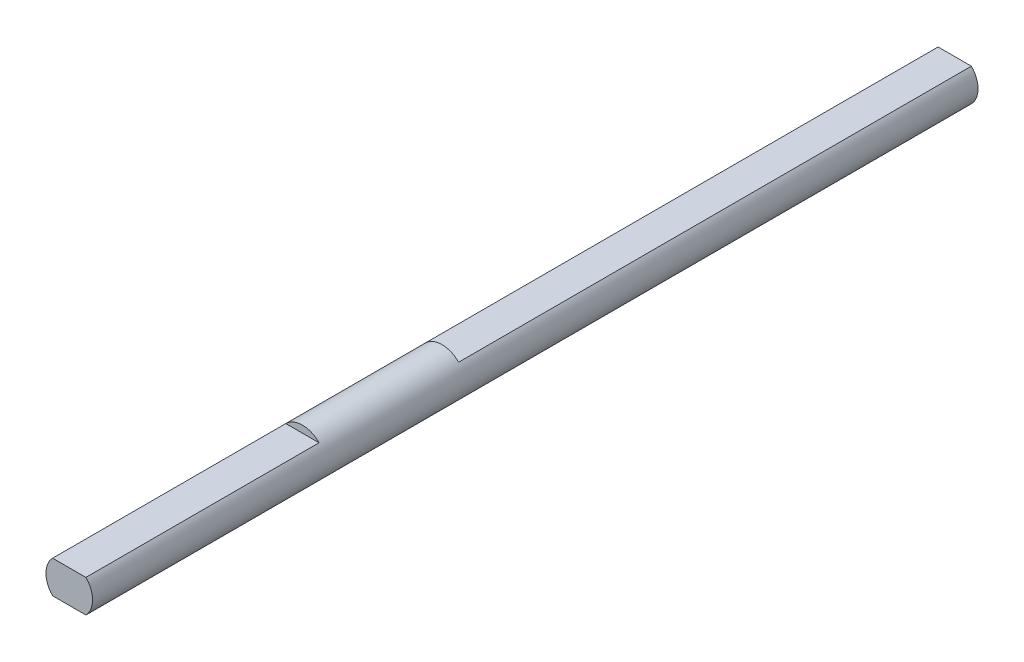
ISO-10303-21;
HEADER;
FILE_DESCRIPTION(('STEP AP214'),'2;1');
FILE_NAME('part.step','',(''),(''),'','','');
FILE_SCHEMA(('AUTOMOTIVE_DESIGN { 1 0 10303 214 1 1 1 1 }'));
ENDSEC;
DATA;
#1=APPLICATION_CONTEXT('core data for automotive mechanical design processes');
#2=APPLICATION_PROTOCOL_DEFINITION('international standard','automotive_design',2000,#1);
#3=PRODUCT_CONTEXT('',#1,'mechanical');
#4=PRODUCT('Part','Part','',(#3));
#5=PRODUCT_RELATED_PRODUCT_CATEGORY('part','',(#4));
#6=PRODUCT_DEFINITION_FORMATION('','',#4);
#7=PRODUCT_DEFINITION_CONTEXT('part definition',#1,'design');
#8=PRODUCT_DEFINITION('design','',#6,#7);
#9=PRODUCT_DEFINITION_SHAPE('','',#8);
#10=(LENGTH_UNIT() NAMED_UNIT(*) SI_UNIT(.MILLI.,.METRE.));
#11=(NAMED_UNIT(*) PLANE_ANGLE_UNIT() SI_UNIT($,.RADIAN.));
#12=(NAMED_UNIT(*) SI_UNIT($,.STERADIAN.) SOLID_ANGLE_UNIT());
#13=UNCERTAINTY_MEASURE_WITH_UNIT(LENGTH_MEASURE(1.E-05),#10,'distance_accuracy_value','');
#14=(GEOMETRIC_REPRESENTATION_CONTEXT(3) GLOBAL_UNCERTAINTY_ASSIGNED_CONTEXT((#13)) GLOBAL_UNIT_ASSIGNED_CONTEXT((#10,
#11,#12)) REPRESENTATION_CONTEXT('',''));
#15=CARTESIAN_POINT('',(0.,0.,0.));
#16=DIRECTION('',(0.,0.,1.));
#17=DIRECTION('',(1.,0.,0.));
#18=AXIS2_PLACEMENT_3D('',#15,#16,#17);
#19=CARTESIAN_POINT('',(0.,0.,-30.));
#20=DIRECTION('',(0.,0.,1.));
#21=DIRECTION('',(1.,0.,0.));
#22=AXIS2_PLACEMENT_3D('',#19,#20,#21);
#23=CYLINDRICAL_SURFACE('',#22,2.5);
#24=DIRECTION('',(0.,0.,1.));
#25=VECTOR('',#24,1.);
#26=CARTESIAN_POINT('',(1.78535710713571,1.75,-30.));
#27=LINE('',#26,#25);
#28=CARTESIAN_POINT('',(1.78535710713571,1.75,25.015));
#29=VERTEX_POINT('',#28);
#30=CARTESIAN_POINT('',(1.78535710713571,1.75,-30.));
#31=VERTEX_POINT('',#30);
#32=EDGE_CURVE('E60',#29,#31,#27,.F.);
#33=ORIENTED_EDGE('',*,*,#32,.F.);
#34=CARTESIAN_POINT('',(0.,0.,25.015));
#35=DIRECTION('',(0.,0.,-1.));
#36=DIRECTION('',(-1.,0.,0.));
#37=AXIS2_PLACEMENT_3D('',#34,#35,#36);
#38=CIRCLE('',#37,2.5);
#39=CARTESIAN_POINT('',(-1.78535710713571,1.75,25.015));
#40=VERTEX_POINT('',#39);
#41=EDGE_CURVE('E11',#29,#40,#38,.F.);
#42=ORIENTED_EDGE('',*,*,#41,.T.);
#43=DIRECTION('',(0.,0.,1.));
#44=VECTOR('',#43,1.);
#45=CARTESIAN_POINT('',(-1.78535710713571,1.75,-30.));
#46=LINE('',#45,#44);
#47=CARTESIAN_POINT('',(-1.78535710713571,1.75,-30.));
#48=VERTEX_POINT('',#47);
#49=EDGE_CURVE('E155',#48,#40,#46,.T.);
#50=ORIENTED_EDGE('',*,*,#49,.F.);
#51=CARTESIAN_POINT('',(0.,0.,-30.));
#52=DIRECTION('',(0.,0.,1.));
#53=DIRECTION('',(1.,0.,0.));
#54=AXIS2_PLACEMENT_3D('',#51,#52,#53);
#55=CIRCLE('',#54,2.5);
#56=CARTESIAN_POINT('',(-1.78535710713571,-1.75,-30.));
#57=VERTEX_POINT('',#56);
#58=EDGE_CURVE('E124',#48,#57,#55,.T.);
#59=ORIENTED_EDGE('',*,*,#58,.T.);
#60=DIRECTION('',(0.,0.,1.));
#61=VECTOR('',#60,1.);
#62=CARTESIAN_POINT('',(-1.78535710713571,-1.75,-30.));
#63=LINE('',#62,#61);
#64=CARTESIAN_POINT('',(-1.78535710713571,-1.75,25.015));
#65=VERTEX_POINT('',#64);
#66=EDGE_CURVE('E52',#65,#57,#63,.F.);
#67=ORIENTED_EDGE('',*,*,#66,.F.);
#68=CARTESIAN_POINT('',(0.,0.,25.015));
#69=DIRECTION('',(0.,0.,1.));
#70=DIRECTION('',(1.,0.,0.));
#71=AXIS2_PLACEMENT_3D('',#68,#69,#70);
#72=CIRCLE('',#71,2.5);
#73=CARTESIAN_POINT('',(1.78535710713571,-1.75,25.015));
#74=VERTEX_POINT('',#73);
#75=EDGE_CURVE('E45',#74,#65,#72,.F.);
#76=ORIENTED_EDGE('',*,*,#75,.F.);
#77=DIRECTION('',(0.,0.,1.));
#78=VECTOR('',#77,1.);
#79=CARTESIAN_POINT('',(1.78535710713571,-1.75,-30.));
#80=LINE('',#79,#78);
#81=CARTESIAN_POINT('',(1.78535710713571,-1.75,-30.));
#82=VERTEX_POINT('',#81);
#83=EDGE_CURVE('E104',#82,#74,#80,.T.);
#84=ORIENTED_EDGE('',*,*,#83,.F.);
#85=EDGE_CURVE('E118',#82,#31,#55,.T.);
#86=ORIENTED_EDGE('',*,*,#85,.T.);
#87=EDGE_LOOP('',(#33,#42,#50,#59,#67,#76,#84,#86));
#88=FACE_BOUND('',#87,.T.);
#89=DIRECTION('',(0.,0.,1.));
#90=VECTOR('',#89,1.);
#91=CARTESIAN_POINT('',(1.78535710713571,1.75,-30.));
#92=LINE('',#91,#90);
#93=CARTESIAN_POINT('',(1.78535710713571,1.75,65.));
#94=VERTEX_POINT('',#93);
#95=CARTESIAN_POINT('',(1.78535710713571,1.75,39.985));
#96=VERTEX_POINT('',#95);
#97=EDGE_CURVE('E178',#94,#96,#92,.F.);
#98=ORIENTED_EDGE('',*,*,#97,.F.);
#99=CARTESIAN_POINT('',(0.,0.,65.));
#100=DIRECTION('',(0.,0.,1.));
#101=DIRECTION('',(1.,0.,0.));
#102=AXIS2_PLACEMENT_3D('',#99,#100,#101);
#103=CIRCLE('',#102,2.5);
#104=CARTESIAN_POINT('',(1.78535710713571,-1.75,65.));
#105=VERTEX_POINT('',#104);
#106=EDGE_CURVE('E131',#105,#94,#103,.T.);
#107=ORIENTED_EDGE('',*,*,#106,.F.);
#108=DIRECTION('',(0.,0.,1.));
#109=VECTOR('',#108,1.);
#110=CARTESIAN_POINT('',(1.78535710713571,-1.75,-30.));
#111=LINE('',#110,#109);
#112=CARTESIAN_POINT('',(1.78535710713571,-1.75,39.985));
#113=VERTEX_POINT('',#112);
#114=EDGE_CURVE('E167',#113,#105,#111,.T.);
#115=ORIENTED_EDGE('',*,*,#114,.F.);
#116=CARTESIAN_POINT('',(0.,0.,39.985));
#117=DIRECTION('',(0.,0.,-1.));
#118=DIRECTION('',(-1.,0.,0.));
#119=AXIS2_PLACEMENT_3D('',#116,#117,#118);
#120=CIRCLE('',#119,2.5);
#121=CARTESIAN_POINT('',(-1.78535710713571,-1.75,39.985));
#122=VERTEX_POINT('',#121);
#123=EDGE_CURVE('E140',#122,#113,#120,.F.);
#124=ORIENTED_EDGE('',*,*,#123,.F.);
#125=DIRECTION('',(0.,0.,1.));
#126=VECTOR('',#125,1.);
#127=CARTESIAN_POINT('',(-1.78535710713571,-1.75,-30.));
#128=LINE('',#127,#126);
#129=CARTESIAN_POINT('',(-1.78535710713571,-1.75,65.));
#130=VERTEX_POINT('',#129);
#131=EDGE_CURVE('E173',#130,#122,#128,.F.);
#132=ORIENTED_EDGE('',*,*,#131,.F.);
#133=CARTESIAN_POINT('',(-1.78535710713571,1.75,65.));
#134=VERTEX_POINT('',#133);
#135=EDGE_CURVE('E125',#134,#130,#103,.T.);
#136=ORIENTED_EDGE('',*,*,#135,.F.);
#137=DIRECTION('',(0.,0.,1.));
#138=VECTOR('',#137,1.);
#139=CARTESIAN_POINT('',(-1.78535710713571,1.75,-30.));
#140=LINE('',#139,#138);
#141=CARTESIAN_POINT('',(-1.78535710713571,1.75,39.985));
#142=VERTEX_POINT('',#141);
#143=EDGE_CURVE('E176',#142,#134,#140,.T.);
#144=ORIENTED_EDGE('',*,*,#143,.F.);
#145=CARTESIAN_POINT('',(0.,0.,39.985));
#146=DIRECTION('',(0.,0.,1.));
#147=DIRECTION('',(1.,0.,0.));
#148=AXIS2_PLACEMENT_3D('',#145,#146,#147);
#149=CIRCLE('',#148,2.5);
#150=EDGE_CURVE('E112',#142,#96,#149,.F.);
#151=ORIENTED_EDGE('',*,*,#150,.T.);
#152=EDGE_LOOP('',(#98,#107,#115,#124,#132,#136,#144,#151));
#153=FACE_BOUND('',#152,.T.);
#154=ADVANCED_FACE('F37',(#88,#153),#23,.T.);
#155=CARTESIAN_POINT('',(0.,0.,-30.));
#156=DIRECTION('',(0.,0.,1.));
#157=DIRECTION('',(1.,0.,0.));
#158=AXIS2_PLACEMENT_3D('',#155,#156,#157);
#159=PLANE('',#158);
#160=ORIENTED_EDGE('',*,*,#58,.F.);
#161=DIRECTION('',(1.,0.,0.));
#162=VECTOR('',#161,1.);
#163=CARTESIAN_POINT('',(0.,1.75,-30.));
#164=LINE('',#163,#162);
#165=EDGE_CURVE('E111',#48,#31,#164,.T.);
#166=ORIENTED_EDGE('',*,*,#165,.T.);
#167=ORIENTED_EDGE('',*,*,#85,.F.);
#168=DIRECTION('',(-1.,0.,0.));
#169=VECTOR('',#168,1.);
#170=CARTESIAN_POINT('',(0.,-1.75,-30.));
#171=LINE('',#170,#169);
#172=EDGE_CURVE('E101',#82,#57,#171,.T.);
#173=ORIENTED_EDGE('',*,*,#172,.T.);
#174=EDGE_LOOP('',(#160,#166,#167,#173));
#175=FACE_BOUND('',#174,.T.);
#176=ADVANCED_FACE('F122',(#175),#159,.F.);
#177=CARTESIAN_POINT('',(0.,0.,65.));
#178=DIRECTION('',(0.,0.,1.));
#179=DIRECTION('',(1.,0.,0.));
#180=AXIS2_PLACEMENT_3D('',#177,#178,#179);
#181=PLANE('',#180);
#182=DIRECTION('',(1.,0.,0.));
#183=VECTOR('',#182,1.);
#184=CARTESIAN_POINT('',(0.,1.75,65.));
#185=LINE('',#184,#183);
#186=EDGE_CURVE('E137',#134,#94,#185,.T.);
#187=ORIENTED_EDGE('',*,*,#186,.F.);
#188=ORIENTED_EDGE('',*,*,#135,.T.);
#189=DIRECTION('',(-1.,0.,0.));
#190=VECTOR('',#189,1.);
#191=CARTESIAN_POINT('',(0.,-1.75,65.));
#192=LINE('',#191,#190);
#193=EDGE_CURVE('E129',#105,#130,#192,.T.);
#194=ORIENTED_EDGE('',*,*,#193,.F.);
#195=ORIENTED_EDGE('',*,*,#106,.T.);
#196=EDGE_LOOP('',(#187,#188,#194,#195));
#197=FACE_BOUND('',#196,.T.);
#198=ADVANCED_FACE('F189',(#197),#181,.T.);
#199=CARTESIAN_POINT('',(0.,-1.75,39.985));
#200=DIRECTION('',(0.,1.,0.));
#201=DIRECTION('',(0.,0.,1.));
#202=AXIS2_PLACEMENT_3D('',#199,#200,#201);
#203=PLANE('',#202);
#204=ORIENTED_EDGE('',*,*,#131,.T.);
#205=DIRECTION('',(-1.,0.,0.));
#206=VECTOR('',#205,1.);
#207=CARTESIAN_POINT('',(-3.67257147029217,-1.75,39.985));
#208=LINE('',#207,#206);
#209=EDGE_CURVE('E162',#113,#122,#208,.T.);
#210=ORIENTED_EDGE('',*,*,#209,.F.);
#211=ORIENTED_EDGE('',*,*,#114,.T.);
#212=ORIENTED_EDGE('',*,*,#193,.T.);
#213=EDGE_LOOP('',(#204,#210,#211,#212));
#214=FACE_BOUND('',#213,.T.);
#215=ADVANCED_FACE('F205',(#214),#203,.F.);
#216=CARTESIAN_POINT('',(0.,0.,39.985));
#217=DIRECTION('',(0.,0.,-1.));
#218=DIRECTION('',(-1.,0.,0.));
#219=AXIS2_PLACEMENT_3D('',#216,#217,#218);
#220=PLANE('',#219);
#221=ORIENTED_EDGE('',*,*,#123,.T.);
#222=ORIENTED_EDGE('',*,*,#209,.T.);
#223=EDGE_LOOP('',(#221,#222));
#224=FACE_BOUND('',#223,.T.);
#225=ADVANCED_FACE('F198',(#224),#220,.F.);
#226=CARTESIAN_POINT('',(0.,1.75,39.985));
#227=DIRECTION('',(0.,-1.,0.));
#228=DIRECTION('',(0.,0.,-1.));
#229=AXIS2_PLACEMENT_3D('',#226,#227,#228);
#230=PLANE('',#229);
#231=ORIENTED_EDGE('',*,*,#97,.T.);
#232=DIRECTION('',(1.,0.,0.));
#233=VECTOR('',#232,1.);
#234=CARTESIAN_POINT('',(-3.67257147029217,1.75,39.985));
#235=LINE('',#234,#233);
#236=EDGE_CURVE('E163',#142,#96,#235,.T.);
#237=ORIENTED_EDGE('',*,*,#236,.F.);
#238=ORIENTED_EDGE('',*,*,#143,.T.);
#239=ORIENTED_EDGE('',*,*,#186,.T.);
#240=EDGE_LOOP('',(#231,#237,#238,#239));
#241=FACE_BOUND('',#240,.T.);
#242=ADVANCED_FACE('F196',(#241),#230,.F.);
#243=CARTESIAN_POINT('',(0.,0.,39.985));
#244=DIRECTION('',(0.,0.,1.));
#245=DIRECTION('',(1.,0.,0.));
#246=AXIS2_PLACEMENT_3D('',#243,#244,#245);
#247=PLANE('',#246);
#248=ORIENTED_EDGE('',*,*,#236,.T.);
#249=ORIENTED_EDGE('',*,*,#150,.F.);
#250=EDGE_LOOP('',(#248,#249));
#251=FACE_BOUND('',#250,.T.);
#252=ADVANCED_FACE('F195',(#251),#247,.T.);
#253=CARTESIAN_POINT('',(0.,-1.75,25.015));
#254=DIRECTION('',(0.,1.,0.));
#255=DIRECTION('',(0.,0.,1.));
#256=AXIS2_PLACEMENT_3D('',#253,#254,#255);
#257=PLANE('',#256);
#258=ORIENTED_EDGE('',*,*,#66,.T.);
#259=ORIENTED_EDGE('',*,*,#172,.F.);
#260=ORIENTED_EDGE('',*,*,#83,.T.);
#261=DIRECTION('',(1.,0.,0.));
#262=VECTOR('',#261,1.);
#263=CARTESIAN_POINT('',(2.87181676904782,-1.75,25.015));
#264=LINE('',#263,#262);
#265=EDGE_CURVE('E150',#65,#74,#264,.T.);
#266=ORIENTED_EDGE('',*,*,#265,.F.);
#267=EDGE_LOOP('',(#258,#259,#260,#266));
#268=FACE_BOUND('',#267,.T.);
#269=ADVANCED_FACE('F103',(#268),#257,.F.);
#270=CARTESIAN_POINT('',(0.,0.,25.015));
#271=DIRECTION('',(0.,0.,1.));
#272=DIRECTION('',(1.,0.,0.));
#273=AXIS2_PLACEMENT_3D('',#270,#271,#272);
#274=PLANE('',#273);
#275=ORIENTED_EDGE('',*,*,#75,.T.);
#276=ORIENTED_EDGE('',*,*,#265,.T.);
#277=EDGE_LOOP('',(#275,#276));
#278=FACE_BOUND('',#277,.T.);
#279=ADVANCED_FACE('F149',(#278),#274,.F.);
#280=CARTESIAN_POINT('',(0.,1.75,25.015));
#281=DIRECTION('',(0.,-1.,0.));
#282=DIRECTION('',(1.,0.,0.));
#283=AXIS2_PLACEMENT_3D('',#280,#281,#282);
#284=PLANE('',#283);
#285=ORIENTED_EDGE('',*,*,#32,.T.);
#286=ORIENTED_EDGE('',*,*,#165,.F.);
#287=ORIENTED_EDGE('',*,*,#49,.T.);
#288=DIRECTION('',(-1.,0.,0.));
#289=VECTOR('',#288,1.);
#290=CARTESIAN_POINT('',(2.87181676904782,1.75,25.015));
#291=LINE('',#290,#289);
#292=EDGE_CURVE('E120',#29,#40,#291,.T.);
#293=ORIENTED_EDGE('',*,*,#292,.F.);
#294=EDGE_LOOP('',(#285,#286,#287,#293));
#295=FACE_BOUND('',#294,.T.);
#296=ADVANCED_FACE('F267',(#295),#284,.F.);
#297=CARTESIAN_POINT('',(0.,0.,25.015));
#298=DIRECTION('',(0.,0.,-1.));
#299=DIRECTION('',(-1.,0.,0.));
#300=AXIS2_PLACEMENT_3D('',#297,#298,#299);
#301=PLANE('',#300);
#302=ORIENTED_EDGE('',*,*,#292,.T.);
#303=ORIENTED_EDGE('',*,*,#41,.F.);
#304=EDGE_LOOP('',(#302,#303));
#305=FACE_BOUND('',#304,.T.);
#306=ADVANCED_FACE('F277',(#305),#301,.T.);
#307=CLOSED_SHELL('',(#154,#176,#198,#215,#225,#242,#252,#269,#279,#296,#306));
#308=MANIFOLD_SOLID_BREP('B2',#307);
#309=ADVANCED_BREP_SHAPE_REPRESENTATION('',(#18,#308),#14);
#310=SHAPE_DEFINITION_REPRESENTATION(#9,#309);
ENDSEC;
END-ISO-10303-21;
